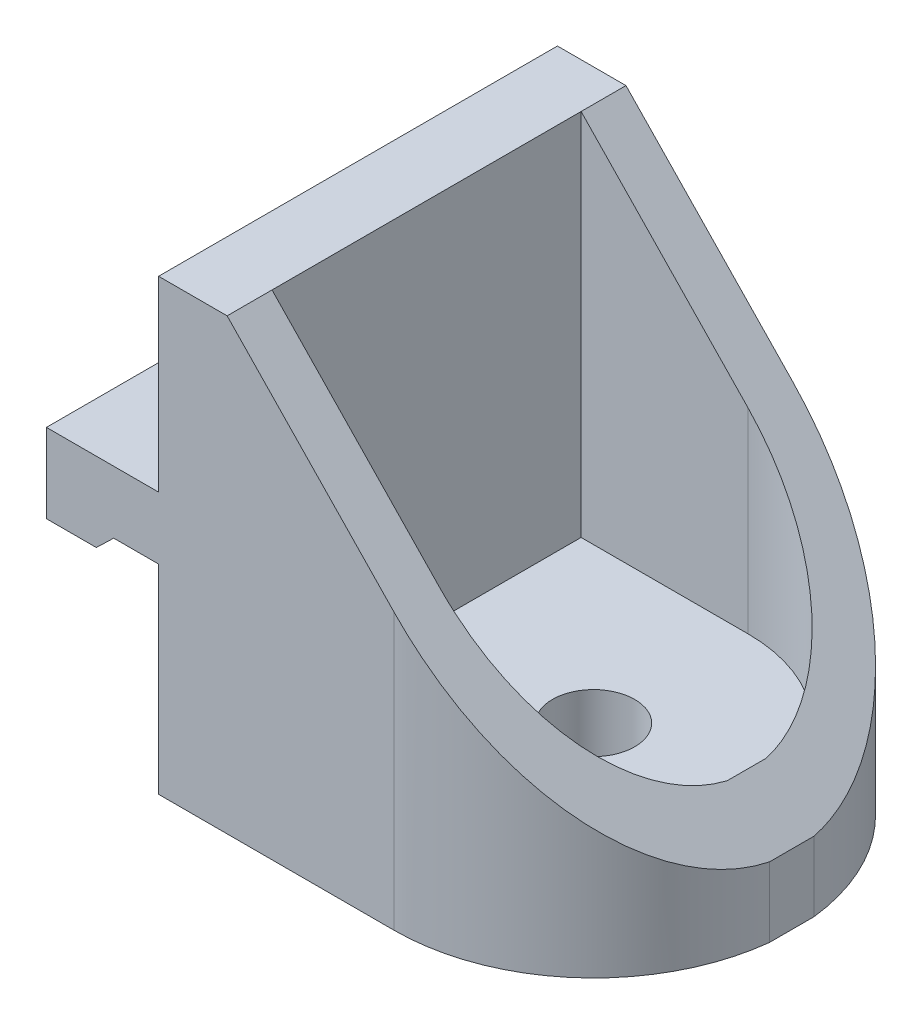
ISO-10303-21;
HEADER;
FILE_DESCRIPTION(('STEP AP214'),'2;1');
FILE_NAME('part.step','',(''),(''),'','','');
FILE_SCHEMA(('AUTOMOTIVE_DESIGN { 1 0 10303 214 1 1 1 1 }'));
ENDSEC;
DATA;
#1=APPLICATION_CONTEXT('core data for automotive mechanical design processes');
#2=APPLICATION_PROTOCOL_DEFINITION('international standard','automotive_design',2000,#1);
#3=PRODUCT_CONTEXT('',#1,'mechanical');
#4=PRODUCT('Part','Part','',(#3));
#5=PRODUCT_RELATED_PRODUCT_CATEGORY('part','',(#4));
#6=PRODUCT_DEFINITION_FORMATION('','',#4);
#7=PRODUCT_DEFINITION_CONTEXT('part definition',#1,'design');
#8=PRODUCT_DEFINITION('design','',#6,#7);
#9=PRODUCT_DEFINITION_SHAPE('','',#8);
#10=(LENGTH_UNIT() NAMED_UNIT(*) SI_UNIT(.MILLI.,.METRE.));
#11=(NAMED_UNIT(*) PLANE_ANGLE_UNIT() SI_UNIT($,.RADIAN.));
#12=(NAMED_UNIT(*) SI_UNIT($,.STERADIAN.) SOLID_ANGLE_UNIT());
#13=UNCERTAINTY_MEASURE_WITH_UNIT(LENGTH_MEASURE(1.E-05),#10,'distance_accuracy_value','');
#14=(GEOMETRIC_REPRESENTATION_CONTEXT(3) GLOBAL_UNCERTAINTY_ASSIGNED_CONTEXT((#13)) GLOBAL_UNIT_ASSIGNED_CONTEXT((#10,
#11,#12)) REPRESENTATION_CONTEXT('',''));
#15=CARTESIAN_POINT('',(0.,0.,0.));
#16=DIRECTION('',(0.,0.,1.));
#17=DIRECTION('',(1.,0.,0.));
#18=AXIS2_PLACEMENT_3D('',#15,#16,#17);
#19=CARTESIAN_POINT('',(-13.4,36.,16.));
#20=DIRECTION('',(-0.720013338320777,-0.693960224105223,0.));
#21=DIRECTION('',(0.693960224105223,-0.720013338320777,0.));
#22=AXIS2_PLACEMENT_3D('',#19,#20,#21);
#23=PLANE('',#22);
#24=DIRECTION('',(-0.693960224105223,0.720013338320777,0.));
#25=VECTOR('',#24,1.);
#26=CARTESIAN_POINT('',(-13.4,36.,-12.4));
#27=LINE('',#26,#25);
#28=CARTESIAN_POINT('',(0.,22.096928327645,-12.4));
#29=VERTEX_POINT('',#28);
#30=CARTESIAN_POINT('',(-13.4,36.,-12.4));
#31=VERTEX_POINT('',#30);
#32=EDGE_CURVE('E11',#29,#31,#27,.T.);
#33=ORIENTED_EDGE('',*,*,#32,.F.);
#34=CARTESIAN_POINT('',(0.,22.096928327645,0.));
#35=DIRECTION('',(-0.720013338320777,-0.693960224105223,0.));
#36=DIRECTION('',(0.693960224105223,-0.720013338320777,0.));
#37=AXIS2_PLACEMENT_3D('',#34,#35,#36);
#38=ELLIPSE('',#37,17.8684592708297,12.4);
#39=CARTESIAN_POINT('',(12.3,9.33515358361774,-1.57162336455017));
#40=VERTEX_POINT('',#39);
#41=EDGE_CURVE('E45',#40,#29,#38,.F.);
#42=ORIENTED_EDGE('',*,*,#41,.F.);
#43=DIRECTION('',(0.,0.,-1.));
#44=VECTOR('',#43,1.);
#45=CARTESIAN_POINT('',(12.3,9.33515358361774,16.));
#46=LINE('',#45,#44);
#47=CARTESIAN_POINT('',(12.3,9.33515358361774,1.57162336455017));
#48=VERTEX_POINT('',#47);
#49=EDGE_CURVE('E209',#48,#40,#46,.T.);
#50=ORIENTED_EDGE('',*,*,#49,.F.);
#51=CARTESIAN_POINT('',(0.,22.096928327645,0.));
#52=DIRECTION('',(-0.720013338320777,-0.693960224105223,0.));
#53=DIRECTION('',(0.693960224105223,-0.720013338320777,0.));
#54=AXIS2_PLACEMENT_3D('',#51,#52,#53);
#55=ELLIPSE('',#54,17.8684592708297,12.4);
#56=CARTESIAN_POINT('',(0.,22.096928327645,12.4));
#57=VERTEX_POINT('',#56);
#58=EDGE_CURVE('E192',#57,#48,#55,.F.);
#59=ORIENTED_EDGE('',*,*,#58,.F.);
#60=DIRECTION('',(0.693960224105223,-0.720013338320777,0.));
#61=VECTOR('',#60,1.);
#62=CARTESIAN_POINT('',(-13.4,36.,12.4));
#63=LINE('',#62,#61);
#64=CARTESIAN_POINT('',(-13.4,36.,12.4));
#65=VERTEX_POINT('',#64);
#66=EDGE_CURVE('E180',#65,#57,#63,.T.);
#67=ORIENTED_EDGE('',*,*,#66,.F.);
#68=DIRECTION('',(0.,0.,-1.));
#69=VECTOR('',#68,1.);
#70=CARTESIAN_POINT('',(-13.4,36.,16.));
#71=LINE('',#70,#69);
#72=CARTESIAN_POINT('',(-13.4,36.,16.));
#73=VERTEX_POINT('',#72);
#74=EDGE_CURVE('E189',#73,#65,#71,.T.);
#75=ORIENTED_EDGE('',*,*,#74,.F.);
#76=DIRECTION('',(-0.693960224105223,0.720013338320777,0.));
#77=VECTOR('',#76,1.);
#78=CARTESIAN_POINT('',(-13.4,36.,16.));
#79=LINE('',#78,#77);
#80=CARTESIAN_POINT('',(0.,22.096928327645,16.));
#81=VERTEX_POINT('',#80);
#82=EDGE_CURVE('E266',#81,#73,#79,.T.);
#83=ORIENTED_EDGE('',*,*,#82,.F.);
#84=CARTESIAN_POINT('',(0.,22.096928327645,0.));
#85=DIRECTION('',(-0.720013338320777,-0.693960224105223,0.));
#86=DIRECTION('',(0.693960224105223,-0.720013338320777,0.));
#87=AXIS2_PLACEMENT_3D('',#84,#85,#86);
#88=ELLIPSE('',#87,23.0560764784899,16.);
#89=CARTESIAN_POINT('',(15.9,5.6,1.78605710994921));
#90=VERTEX_POINT('',#89);
#91=EDGE_CURVE('E59',#81,#90,#88,.F.);
#92=ORIENTED_EDGE('',*,*,#91,.T.);
#93=DIRECTION('',(0.,0.,-1.));
#94=VECTOR('',#93,1.);
#95=CARTESIAN_POINT('',(15.9,5.6,16.));
#96=LINE('',#95,#94);
#97=CARTESIAN_POINT('',(15.9,5.6,-1.7860571099492));
#98=VERTEX_POINT('',#97);
#99=EDGE_CURVE('E198',#90,#98,#96,.T.);
#100=ORIENTED_EDGE('',*,*,#99,.T.);
#101=CARTESIAN_POINT('',(0.,22.096928327645,-16.));
#102=VERTEX_POINT('',#101);
#103=EDGE_CURVE('E312',#98,#102,#88,.F.);
#104=ORIENTED_EDGE('',*,*,#103,.T.);
#105=DIRECTION('',(-0.693960224105223,0.720013338320777,0.));
#106=VECTOR('',#105,1.);
#107=CARTESIAN_POINT('',(-13.4,36.,-16.));
#108=LINE('',#107,#106);
#109=CARTESIAN_POINT('',(-13.4,36.,-16.));
#110=VERTEX_POINT('',#109);
#111=EDGE_CURVE('E229',#102,#110,#108,.T.);
#112=ORIENTED_EDGE('',*,*,#111,.T.);
#113=EDGE_CURVE('E199',#31,#110,#71,.T.);
#114=ORIENTED_EDGE('',*,*,#113,.F.);
#115=EDGE_LOOP('',(#33,#42,#50,#59,#67,#75,#83,#92,#100,#104,#112,#114));
#116=FACE_BOUND('',#115,.T.);
#117=ADVANCED_FACE('F36',(#116),#23,.F.);
#118=CARTESIAN_POINT('',(15.9,0.,16.));
#119=DIRECTION('',(0.,1.,0.));
#120=DIRECTION('',(-1.,0.,0.));
#121=AXIS2_PLACEMENT_3D('',#118,#119,#120);
#122=PLANE('',#121);
#123=CARTESIAN_POINT('',(0.,0.,0.));
#124=DIRECTION('',(0.,1.,0.));
#125=DIRECTION('',(0.,0.,1.));
#126=AXIS2_PLACEMENT_3D('',#123,#124,#125);
#127=CIRCLE('',#126,3.29864911449007);
#128=CARTESIAN_POINT('',(0.,0.,3.29864911449007));
#129=VERTEX_POINT('',#128);
#130=EDGE_CURVE('E591',#129,#129,#127,.T.);
#131=ORIENTED_EDGE('',*,*,#130,.T.);
#132=EDGE_LOOP('',(#131));
#133=FACE_BOUND('',#132,.T.);
#134=DIRECTION('',(1.,0.,0.));
#135=VECTOR('',#134,1.);
#136=CARTESIAN_POINT('',(15.9,0.,-16.));
#137=LINE('',#136,#135);
#138=CARTESIAN_POINT('',(-18.9,0.,-16.));
#139=VERTEX_POINT('',#138);
#140=CARTESIAN_POINT('',(0.,0.,-16.));
#141=VERTEX_POINT('',#140);
#142=EDGE_CURVE('E263',#139,#141,#137,.T.);
#143=ORIENTED_EDGE('',*,*,#142,.T.);
#144=CARTESIAN_POINT('',(0.,0.,0.));
#145=DIRECTION('',(0.,1.,0.));
#146=DIRECTION('',(-1.,0.,0.));
#147=AXIS2_PLACEMENT_3D('',#144,#145,#146);
#148=CIRCLE('',#147,16.);
#149=CARTESIAN_POINT('',(15.9,0.,-1.78605710994917));
#150=VERTEX_POINT('',#149);
#151=EDGE_CURVE('E330',#150,#141,#148,.T.);
#152=ORIENTED_EDGE('',*,*,#151,.F.);
#153=DIRECTION('',(0.,0.,-1.));
#154=VECTOR('',#153,1.);
#155=CARTESIAN_POINT('',(15.9,0.,16.));
#156=LINE('',#155,#154);
#157=CARTESIAN_POINT('',(15.9,0.,1.78605710994917));
#158=VERTEX_POINT('',#157);
#159=EDGE_CURVE('E267',#158,#150,#156,.T.);
#160=ORIENTED_EDGE('',*,*,#159,.F.);
#161=CARTESIAN_POINT('',(0.,0.,16.));
#162=VERTEX_POINT('',#161);
#163=EDGE_CURVE('E329',#162,#158,#148,.T.);
#164=ORIENTED_EDGE('',*,*,#163,.F.);
#165=DIRECTION('',(1.,0.,0.));
#166=VECTOR('',#165,1.);
#167=CARTESIAN_POINT('',(15.9,0.,16.));
#168=LINE('',#167,#166);
#169=CARTESIAN_POINT('',(-18.9,0.,16.));
#170=VERTEX_POINT('',#169);
#171=EDGE_CURVE('E271',#170,#162,#168,.T.);
#172=ORIENTED_EDGE('',*,*,#171,.F.);
#173=DIRECTION('',(0.,0.,-1.));
#174=VECTOR('',#173,1.);
#175=CARTESIAN_POINT('',(-18.9,0.,16.));
#176=LINE('',#175,#174);
#177=EDGE_CURVE('E270',#170,#139,#176,.T.);
#178=ORIENTED_EDGE('',*,*,#177,.T.);
#179=EDGE_LOOP('',(#143,#152,#160,#164,#172,#178));
#180=FACE_BOUND('',#179,.T.);
#181=ADVANCED_FACE('F327',(#133,#180),#122,.F.);
#182=CARTESIAN_POINT('',(15.9,5.6,16.));
#183=DIRECTION('',(-1.,0.,0.));
#184=DIRECTION('',(0.,-1.,0.));
#185=AXIS2_PLACEMENT_3D('',#182,#183,#184);
#186=PLANE('',#185);
#187=ORIENTED_EDGE('',*,*,#159,.T.);
#188=DIRECTION('',(0.,-1.,0.));
#189=VECTOR('',#188,1.);
#190=CARTESIAN_POINT('',(15.9,36.,-1.78605710994932));
#191=LINE('',#190,#189);
#192=EDGE_CURVE('E310',#150,#98,#191,.F.);
#193=ORIENTED_EDGE('',*,*,#192,.T.);
#194=ORIENTED_EDGE('',*,*,#99,.F.);
#195=DIRECTION('',(0.,-1.,0.));
#196=VECTOR('',#195,1.);
#197=CARTESIAN_POINT('',(15.9,36.,1.78605710994932));
#198=LINE('',#197,#196);
#199=EDGE_CURVE('E316',#90,#158,#198,.T.);
#200=ORIENTED_EDGE('',*,*,#199,.T.);
#201=EDGE_LOOP('',(#187,#193,#194,#200));
#202=FACE_BOUND('',#201,.T.);
#203=ADVANCED_FACE('F38',(#202),#186,.F.);
#204=CARTESIAN_POINT('',(-18.9,36.,16.));
#205=DIRECTION('',(0.,-1.,0.));
#206=DIRECTION('',(0.,0.,-1.));
#207=AXIS2_PLACEMENT_3D('',#204,#205,#206);
#208=PLANE('',#207);
#209=DIRECTION('',(-1.,0.,0.));
#210=VECTOR('',#209,1.);
#211=CARTESIAN_POINT('',(-18.9,36.,-16.));
#212=LINE('',#211,#210);
#213=CARTESIAN_POINT('',(-18.9,36.,-16.));
#214=VERTEX_POINT('',#213);
#215=EDGE_CURVE('E231',#110,#214,#212,.T.);
#216=ORIENTED_EDGE('',*,*,#215,.T.);
#217=DIRECTION('',(0.,0.,-1.));
#218=VECTOR('',#217,1.);
#219=CARTESIAN_POINT('',(-18.9,36.,16.));
#220=LINE('',#219,#218);
#221=CARTESIAN_POINT('',(-18.9,36.,16.));
#222=VERTEX_POINT('',#221);
#223=EDGE_CURVE('E203',#222,#214,#220,.T.);
#224=ORIENTED_EDGE('',*,*,#223,.F.);
#225=DIRECTION('',(-1.,0.,0.));
#226=VECTOR('',#225,1.);
#227=CARTESIAN_POINT('',(-18.9,36.,16.));
#228=LINE('',#227,#226);
#229=EDGE_CURVE('E197',#73,#222,#228,.T.);
#230=ORIENTED_EDGE('',*,*,#229,.F.);
#231=ORIENTED_EDGE('',*,*,#74,.T.);
#232=DIRECTION('',(0.,0.,1.));
#233=VECTOR('',#232,1.);
#234=CARTESIAN_POINT('',(-13.4,36.,12.4));
#235=LINE('',#234,#233);
#236=EDGE_CURVE('E167',#31,#65,#235,.T.);
#237=ORIENTED_EDGE('',*,*,#236,.F.);
#238=ORIENTED_EDGE('',*,*,#113,.T.);
#239=EDGE_LOOP('',(#216,#224,#230,#231,#237,#238));
#240=FACE_BOUND('',#239,.T.);
#241=ADVANCED_FACE('F195',(#240),#208,.F.);
#242=CARTESIAN_POINT('',(-18.9,21.,16.));
#243=DIRECTION('',(1.,0.,0.));
#244=DIRECTION('',(0.,0.,-1.));
#245=AXIS2_PLACEMENT_3D('',#242,#243,#244);
#246=PLANE('',#245);
#247=DIRECTION('',(0.,-1.,0.));
#248=VECTOR('',#247,1.);
#249=CARTESIAN_POINT('',(-18.9,21.,-16.));
#250=LINE('',#249,#248);
#251=CARTESIAN_POINT('',(-18.9,21.,-16.));
#252=VERTEX_POINT('',#251);
#253=EDGE_CURVE('E236',#214,#252,#250,.T.);
#254=ORIENTED_EDGE('',*,*,#253,.T.);
#255=DIRECTION('',(0.,0.,-1.));
#256=VECTOR('',#255,1.);
#257=CARTESIAN_POINT('',(-18.9,21.,16.));
#258=LINE('',#257,#256);
#259=CARTESIAN_POINT('',(-18.9,21.,16.));
#260=VERTEX_POINT('',#259);
#261=EDGE_CURVE('E243',#260,#252,#258,.T.);
#262=ORIENTED_EDGE('',*,*,#261,.F.);
#263=DIRECTION('',(0.,-1.,0.));
#264=VECTOR('',#263,1.);
#265=CARTESIAN_POINT('',(-18.9,21.,16.));
#266=LINE('',#265,#264);
#267=EDGE_CURVE('E242',#222,#260,#266,.T.);
#268=ORIENTED_EDGE('',*,*,#267,.F.);
#269=ORIENTED_EDGE('',*,*,#223,.T.);
#270=EDGE_LOOP('',(#254,#262,#268,#269));
#271=FACE_BOUND('',#270,.T.);
#272=ADVANCED_FACE('F239',(#271),#246,.F.);
#273=CARTESIAN_POINT('',(-18.9,21.,16.));
#274=DIRECTION('',(0.,-1.,0.));
#275=DIRECTION('',(0.,0.,-1.));
#276=AXIS2_PLACEMENT_3D('',#273,#274,#275);
#277=PLANE('',#276);
#278=DIRECTION('',(-1.,0.,0.));
#279=VECTOR('',#278,1.);
#280=CARTESIAN_POINT('',(-18.9,21.,-16.));
#281=LINE('',#280,#279);
#282=CARTESIAN_POINT('',(-27.9,21.,-16.));
#283=VERTEX_POINT('',#282);
#284=EDGE_CURVE('E248',#252,#283,#281,.T.);
#285=ORIENTED_EDGE('',*,*,#284,.T.);
#286=DIRECTION('',(0.,0.,-1.));
#287=VECTOR('',#286,1.);
#288=CARTESIAN_POINT('',(-27.9,21.,16.));
#289=LINE('',#288,#287);
#290=CARTESIAN_POINT('',(-27.9,21.,16.));
#291=VERTEX_POINT('',#290);
#292=EDGE_CURVE('E286',#291,#283,#289,.T.);
#293=ORIENTED_EDGE('',*,*,#292,.F.);
#294=DIRECTION('',(-1.,0.,0.));
#295=VECTOR('',#294,1.);
#296=CARTESIAN_POINT('',(-18.9,21.,16.));
#297=LINE('',#296,#295);
#298=EDGE_CURVE('E292',#260,#291,#297,.T.);
#299=ORIENTED_EDGE('',*,*,#298,.F.);
#300=ORIENTED_EDGE('',*,*,#261,.T.);
#301=EDGE_LOOP('',(#285,#293,#299,#300));
#302=FACE_BOUND('',#301,.T.);
#303=ADVANCED_FACE('F290',(#302),#277,.F.);
#304=CARTESIAN_POINT('',(-27.9,21.,16.));
#305=DIRECTION('',(1.,0.,0.));
#306=DIRECTION('',(0.,0.,-1.));
#307=AXIS2_PLACEMENT_3D('',#304,#305,#306);
#308=PLANE('',#307);
#309=DIRECTION('',(0.,-1.,0.));
#310=VECTOR('',#309,1.);
#311=CARTESIAN_POINT('',(-27.9,21.,-16.));
#312=LINE('',#311,#310);
#313=CARTESIAN_POINT('',(-27.9,14.6506578947368,-16.));
#314=VERTEX_POINT('',#313);
#315=EDGE_CURVE('E250',#283,#314,#312,.T.);
#316=ORIENTED_EDGE('',*,*,#315,.T.);
#317=DIRECTION('',(0.,0.,-1.));
#318=VECTOR('',#317,1.);
#319=CARTESIAN_POINT('',(-27.9,14.6506578947368,16.));
#320=LINE('',#319,#318);
#321=CARTESIAN_POINT('',(-27.9,14.6506578947368,16.));
#322=VERTEX_POINT('',#321);
#323=EDGE_CURVE('E283',#322,#314,#320,.T.);
#324=ORIENTED_EDGE('',*,*,#323,.F.);
#325=DIRECTION('',(0.,-1.,0.));
#326=VECTOR('',#325,1.);
#327=CARTESIAN_POINT('',(-27.9,21.,16.));
#328=LINE('',#327,#326);
#329=EDGE_CURVE('E295',#291,#322,#328,.T.);
#330=ORIENTED_EDGE('',*,*,#329,.F.);
#331=ORIENTED_EDGE('',*,*,#292,.T.);
#332=EDGE_LOOP('',(#316,#324,#330,#331));
#333=FACE_BOUND('',#332,.T.);
#334=ADVANCED_FACE('F364',(#333),#308,.F.);
#335=CARTESIAN_POINT('',(-27.9,14.6506578947368,16.));
#336=DIRECTION('',(0.,1.,0.));
#337=DIRECTION('',(0.,0.,1.));
#338=AXIS2_PLACEMENT_3D('',#335,#336,#337);
#339=PLANE('',#338);
#340=DIRECTION('',(1.,0.,0.));
#341=VECTOR('',#340,1.);
#342=CARTESIAN_POINT('',(-27.9,14.6506578947368,-16.));
#343=LINE('',#342,#341);
#344=CARTESIAN_POINT('',(-23.9,14.6506578947368,-16.));
#345=VERTEX_POINT('',#344);
#346=EDGE_CURVE('E255',#314,#345,#343,.T.);
#347=ORIENTED_EDGE('',*,*,#346,.T.);
#348=DIRECTION('',(0.,0.,-1.));
#349=VECTOR('',#348,1.);
#350=CARTESIAN_POINT('',(-23.9,14.6506578947368,16.));
#351=LINE('',#350,#349);
#352=CARTESIAN_POINT('',(-23.9,14.6506578947368,16.));
#353=VERTEX_POINT('',#352);
#354=EDGE_CURVE('E280',#353,#345,#351,.T.);
#355=ORIENTED_EDGE('',*,*,#354,.F.);
#356=DIRECTION('',(1.,0.,0.));
#357=VECTOR('',#356,1.);
#358=CARTESIAN_POINT('',(-27.9,14.6506578947368,16.));
#359=LINE('',#358,#357);
#360=EDGE_CURVE('E297',#322,#353,#359,.T.);
#361=ORIENTED_EDGE('',*,*,#360,.F.);
#362=ORIENTED_EDGE('',*,*,#323,.T.);
#363=EDGE_LOOP('',(#347,#355,#361,#362));
#364=FACE_BOUND('',#363,.T.);
#365=ADVANCED_FACE('F367',(#364),#339,.F.);
#366=CARTESIAN_POINT('',(-23.9,14.6506578947368,16.));
#367=DIRECTION('',(-0.693960224105223,0.720013338320776,0.));
#368=DIRECTION('',(-0.720013338320776,-0.693960224105223,0.));
#369=AXIS2_PLACEMENT_3D('',#366,#367,#368);
#370=PLANE('',#369);
#371=DIRECTION('',(0.720013338320776,0.693960224105223,0.));
#372=VECTOR('',#371,1.);
#373=CARTESIAN_POINT('',(-23.9,14.6506578947368,-16.));
#374=LINE('',#373,#372);
#375=CARTESIAN_POINT('',(-22.5,16.,-16.));
#376=VERTEX_POINT('',#375);
#377=EDGE_CURVE('E257',#345,#376,#374,.T.);
#378=ORIENTED_EDGE('',*,*,#377,.T.);
#379=DIRECTION('',(0.,0.,-1.));
#380=VECTOR('',#379,1.);
#381=CARTESIAN_POINT('',(-22.5,16.,16.));
#382=LINE('',#381,#380);
#383=CARTESIAN_POINT('',(-22.5,16.,16.));
#384=VERTEX_POINT('',#383);
#385=EDGE_CURVE('E277',#384,#376,#382,.T.);
#386=ORIENTED_EDGE('',*,*,#385,.F.);
#387=DIRECTION('',(0.720013338320776,0.693960224105223,0.));
#388=VECTOR('',#387,1.);
#389=CARTESIAN_POINT('',(-23.9,14.6506578947368,16.));
#390=LINE('',#389,#388);
#391=EDGE_CURVE('E303',#353,#384,#390,.T.);
#392=ORIENTED_EDGE('',*,*,#391,.F.);
#393=ORIENTED_EDGE('',*,*,#354,.T.);
#394=EDGE_LOOP('',(#378,#386,#392,#393));
#395=FACE_BOUND('',#394,.T.);
#396=ADVANCED_FACE('F371',(#395),#370,.F.);
#397=CARTESIAN_POINT('',(-22.5,16.,16.));
#398=DIRECTION('',(0.,1.,0.));
#399=DIRECTION('',(0.,0.,1.));
#400=AXIS2_PLACEMENT_3D('',#397,#398,#399);
#401=PLANE('',#400);
#402=DIRECTION('',(1.,0.,0.));
#403=VECTOR('',#402,1.);
#404=CARTESIAN_POINT('',(-22.5,16.,-16.));
#405=LINE('',#404,#403);
#406=CARTESIAN_POINT('',(-18.9,16.,-16.));
#407=VERTEX_POINT('',#406);
#408=EDGE_CURVE('E259',#376,#407,#405,.T.);
#409=ORIENTED_EDGE('',*,*,#408,.T.);
#410=DIRECTION('',(0.,0.,-1.));
#411=VECTOR('',#410,1.);
#412=CARTESIAN_POINT('',(-18.9,16.,16.));
#413=LINE('',#412,#411);
#414=CARTESIAN_POINT('',(-18.9,16.,16.));
#415=VERTEX_POINT('',#414);
#416=EDGE_CURVE('E274',#415,#407,#413,.T.);
#417=ORIENTED_EDGE('',*,*,#416,.F.);
#418=DIRECTION('',(1.,0.,0.));
#419=VECTOR('',#418,1.);
#420=CARTESIAN_POINT('',(-22.5,16.,16.));
#421=LINE('',#420,#419);
#422=EDGE_CURVE('E305',#384,#415,#421,.T.);
#423=ORIENTED_EDGE('',*,*,#422,.F.);
#424=ORIENTED_EDGE('',*,*,#385,.T.);
#425=EDGE_LOOP('',(#409,#417,#423,#424));
#426=FACE_BOUND('',#425,.T.);
#427=ADVANCED_FACE('F375',(#426),#401,.F.);
#428=CARTESIAN_POINT('',(-18.9,0.,16.));
#429=DIRECTION('',(1.,0.,0.));
#430=DIRECTION('',(0.,0.,-1.));
#431=AXIS2_PLACEMENT_3D('',#428,#429,#430);
#432=PLANE('',#431);
#433=DIRECTION('',(0.,-1.,0.));
#434=VECTOR('',#433,1.);
#435=CARTESIAN_POINT('',(-18.9,0.,-16.));
#436=LINE('',#435,#434);
#437=EDGE_CURVE('E261',#407,#139,#436,.T.);
#438=ORIENTED_EDGE('',*,*,#437,.T.);
#439=ORIENTED_EDGE('',*,*,#177,.F.);
#440=DIRECTION('',(0.,-1.,0.));
#441=VECTOR('',#440,1.);
#442=CARTESIAN_POINT('',(-18.9,0.,16.));
#443=LINE('',#442,#441);
#444=EDGE_CURVE('E307',#415,#170,#443,.T.);
#445=ORIENTED_EDGE('',*,*,#444,.F.);
#446=ORIENTED_EDGE('',*,*,#416,.T.);
#447=EDGE_LOOP('',(#438,#439,#445,#446));
#448=FACE_BOUND('',#447,.T.);
#449=ADVANCED_FACE('F379',(#448),#432,.F.);
#450=CARTESIAN_POINT('',(0.,0.,16.));
#451=DIRECTION('',(0.,0.,-1.));
#452=DIRECTION('',(-1.,0.,0.));
#453=AXIS2_PLACEMENT_3D('',#450,#451,#452);
#454=PLANE('',#453);
#455=ORIENTED_EDGE('',*,*,#171,.T.);
#456=DIRECTION('',(0.,-1.,0.));
#457=VECTOR('',#456,1.);
#458=CARTESIAN_POINT('',(0.,36.,16.));
#459=LINE('',#458,#457);
#460=EDGE_CURVE('E321',#81,#162,#459,.T.);
#461=ORIENTED_EDGE('',*,*,#460,.F.);
#462=ORIENTED_EDGE('',*,*,#82,.T.);
#463=ORIENTED_EDGE('',*,*,#229,.T.);
#464=ORIENTED_EDGE('',*,*,#267,.T.);
#465=ORIENTED_EDGE('',*,*,#298,.T.);
#466=ORIENTED_EDGE('',*,*,#329,.T.);
#467=ORIENTED_EDGE('',*,*,#360,.T.);
#468=ORIENTED_EDGE('',*,*,#391,.T.);
#469=ORIENTED_EDGE('',*,*,#422,.T.);
#470=ORIENTED_EDGE('',*,*,#444,.T.);
#471=EDGE_LOOP('',(#455,#461,#462,#463,#464,#465,#466,#467,#468,#469,#470));
#472=FACE_BOUND('',#471,.T.);
#473=ADVANCED_FACE('F320',(#472),#454,.F.);
#474=CARTESIAN_POINT('',(0.,0.,-16.));
#475=DIRECTION('',(0.,0.,-1.));
#476=DIRECTION('',(-1.,0.,0.));
#477=AXIS2_PLACEMENT_3D('',#474,#475,#476);
#478=PLANE('',#477);
#479=DIRECTION('',(0.,1.,0.));
#480=VECTOR('',#479,1.);
#481=CARTESIAN_POINT('',(0.,0.,-16.));
#482=LINE('',#481,#480);
#483=EDGE_CURVE('E193',#141,#102,#482,.T.);
#484=ORIENTED_EDGE('',*,*,#483,.F.);
#485=ORIENTED_EDGE('',*,*,#142,.F.);
#486=ORIENTED_EDGE('',*,*,#437,.F.);
#487=ORIENTED_EDGE('',*,*,#408,.F.);
#488=ORIENTED_EDGE('',*,*,#377,.F.);
#489=ORIENTED_EDGE('',*,*,#346,.F.);
#490=ORIENTED_EDGE('',*,*,#315,.F.);
#491=ORIENTED_EDGE('',*,*,#284,.F.);
#492=ORIENTED_EDGE('',*,*,#253,.F.);
#493=ORIENTED_EDGE('',*,*,#215,.F.);
#494=ORIENTED_EDGE('',*,*,#111,.F.);
#495=EDGE_LOOP('',(#484,#485,#486,#487,#488,#489,#490,#491,#492,#493,#494));
#496=FACE_BOUND('',#495,.T.);
#497=ADVANCED_FACE('F246',(#496),#478,.T.);
#498=CARTESIAN_POINT('',(0.,36.,0.));
#499=DIRECTION('',(0.,-1.,0.));
#500=DIRECTION('',(1.,0.,0.));
#501=AXIS2_PLACEMENT_3D('',#498,#499,#500);
#502=CYLINDRICAL_SURFACE('',#501,16.);
#503=ORIENTED_EDGE('',*,*,#151,.T.);
#504=ORIENTED_EDGE('',*,*,#483,.T.);
#505=ORIENTED_EDGE('',*,*,#103,.F.);
#506=ORIENTED_EDGE('',*,*,#192,.F.);
#507=EDGE_LOOP('',(#503,#504,#505,#506));
#508=FACE_BOUND('',#507,.T.);
#509=ADVANCED_FACE('F341',(#508),#502,.T.);
#510=ORIENTED_EDGE('',*,*,#91,.F.);
#511=ORIENTED_EDGE('',*,*,#460,.T.);
#512=ORIENTED_EDGE('',*,*,#163,.T.);
#513=ORIENTED_EDGE('',*,*,#199,.F.);
#514=EDGE_LOOP('',(#510,#511,#512,#513));
#515=FACE_BOUND('',#514,.T.);
#516=ADVANCED_FACE('F338',(#515),#502,.T.);
#517=CARTESIAN_POINT('',(0.,36.,0.));
#518=DIRECTION('',(0.,-1.,0.));
#519=DIRECTION('',(0.,0.,-1.));
#520=AXIS2_PLACEMENT_3D('',#517,#518,#519);
#521=CYLINDRICAL_SURFACE('',#520,12.4);
#522=ORIENTED_EDGE('',*,*,#58,.T.);
#523=DIRECTION('',(0.,-1.,0.));
#524=VECTOR('',#523,1.);
#525=CARTESIAN_POINT('',(12.3,36.,1.57162336455017));
#526=LINE('',#525,#524);
#527=CARTESIAN_POINT('',(12.3,6.4,1.57162336455017));
#528=VERTEX_POINT('',#527);
#529=EDGE_CURVE('E333',#48,#528,#526,.T.);
#530=ORIENTED_EDGE('',*,*,#529,.T.);
#531=CARTESIAN_POINT('',(0.,6.4,0.));
#532=DIRECTION('',(0.,1.,0.));
#533=DIRECTION('',(0.,0.,1.));
#534=AXIS2_PLACEMENT_3D('',#531,#532,#533);
#535=CIRCLE('',#534,12.4);
#536=CARTESIAN_POINT('',(0.,6.4,12.4));
#537=VERTEX_POINT('',#536);
#538=EDGE_CURVE('E593',#537,#528,#535,.T.);
#539=ORIENTED_EDGE('',*,*,#538,.F.);
#540=DIRECTION('',(0.,-1.,0.));
#541=VECTOR('',#540,1.);
#542=CARTESIAN_POINT('',(0.,36.,12.4));
#543=LINE('',#542,#541);
#544=EDGE_CURVE('E174',#57,#537,#543,.T.);
#545=ORIENTED_EDGE('',*,*,#544,.F.);
#546=EDGE_LOOP('',(#522,#530,#539,#545));
#547=FACE_BOUND('',#546,.T.);
#548=ADVANCED_FACE('F340',(#547),#521,.F.);
#549=CARTESIAN_POINT('',(12.3,36.,1.57162336455017));
#550=DIRECTION('',(-1.,0.,0.));
#551=DIRECTION('',(0.,0.,1.));
#552=AXIS2_PLACEMENT_3D('',#549,#550,#551);
#553=PLANE('',#552);
#554=ORIENTED_EDGE('',*,*,#49,.T.);
#555=DIRECTION('',(0.,-1.,0.));
#556=VECTOR('',#555,1.);
#557=CARTESIAN_POINT('',(12.3,36.,-1.57162336455017));
#558=LINE('',#557,#556);
#559=CARTESIAN_POINT('',(12.3,6.4,-1.57162336455017));
#560=VERTEX_POINT('',#559);
#561=EDGE_CURVE('E219',#40,#560,#558,.T.);
#562=ORIENTED_EDGE('',*,*,#561,.T.);
#563=DIRECTION('',(0.,0.,-1.));
#564=VECTOR('',#563,1.);
#565=CARTESIAN_POINT('',(12.3,6.4,1.57162336455017));
#566=LINE('',#565,#564);
#567=EDGE_CURVE('E597',#528,#560,#566,.T.);
#568=ORIENTED_EDGE('',*,*,#567,.F.);
#569=ORIENTED_EDGE('',*,*,#529,.F.);
#570=EDGE_LOOP('',(#554,#562,#568,#569));
#571=FACE_BOUND('',#570,.T.);
#572=ADVANCED_FACE('F347',(#571),#553,.T.);
#573=CARTESIAN_POINT('',(0.,36.,0.));
#574=DIRECTION('',(0.,-1.,0.));
#575=DIRECTION('',(0.,0.,-1.));
#576=AXIS2_PLACEMENT_3D('',#573,#574,#575);
#577=CYLINDRICAL_SURFACE('',#576,12.4);
#578=ORIENTED_EDGE('',*,*,#41,.T.);
#579=DIRECTION('',(0.,-1.,0.));
#580=VECTOR('',#579,1.);
#581=CARTESIAN_POINT('',(0.,36.,-12.4));
#582=LINE('',#581,#580);
#583=CARTESIAN_POINT('',(0.,6.4,-12.4));
#584=VERTEX_POINT('',#583);
#585=EDGE_CURVE('E217',#29,#584,#582,.T.);
#586=ORIENTED_EDGE('',*,*,#585,.T.);
#587=CARTESIAN_POINT('',(0.,6.4,0.));
#588=DIRECTION('',(0.,1.,0.));
#589=DIRECTION('',(0.,0.,1.));
#590=AXIS2_PLACEMENT_3D('',#587,#588,#589);
#591=CIRCLE('',#590,12.4);
#592=EDGE_CURVE('E600',#560,#584,#591,.T.);
#593=ORIENTED_EDGE('',*,*,#592,.F.);
#594=ORIENTED_EDGE('',*,*,#561,.F.);
#595=EDGE_LOOP('',(#578,#586,#593,#594));
#596=FACE_BOUND('',#595,.T.);
#597=ADVANCED_FACE('F215',(#596),#577,.F.);
#598=CARTESIAN_POINT('',(0.,36.,-12.4));
#599=DIRECTION('',(0.,0.,1.));
#600=DIRECTION('',(1.,0.,0.));
#601=AXIS2_PLACEMENT_3D('',#598,#599,#600);
#602=PLANE('',#601);
#603=ORIENTED_EDGE('',*,*,#32,.T.);
#604=DIRECTION('',(0.,-1.,0.));
#605=VECTOR('',#604,1.);
#606=CARTESIAN_POINT('',(-13.4,36.,-12.4));
#607=LINE('',#606,#605);
#608=CARTESIAN_POINT('',(-13.4,6.4,-12.4));
#609=VERTEX_POINT('',#608);
#610=EDGE_CURVE('E52',#31,#609,#607,.T.);
#611=ORIENTED_EDGE('',*,*,#610,.T.);
#612=DIRECTION('',(-1.,0.,0.));
#613=VECTOR('',#612,1.);
#614=CARTESIAN_POINT('',(0.,6.4,-12.4));
#615=LINE('',#614,#613);
#616=EDGE_CURVE('E224',#584,#609,#615,.T.);
#617=ORIENTED_EDGE('',*,*,#616,.F.);
#618=ORIENTED_EDGE('',*,*,#585,.F.);
#619=EDGE_LOOP('',(#603,#611,#617,#618));
#620=FACE_BOUND('',#619,.T.);
#621=ADVANCED_FACE('F222',(#620),#602,.T.);
#622=CARTESIAN_POINT('',(-13.4,36.,12.4));
#623=DIRECTION('',(0.,0.,-1.));
#624=DIRECTION('',(-1.,0.,0.));
#625=AXIS2_PLACEMENT_3D('',#622,#623,#624);
#626=PLANE('',#625);
#627=ORIENTED_EDGE('',*,*,#66,.T.);
#628=ORIENTED_EDGE('',*,*,#544,.T.);
#629=DIRECTION('',(1.,0.,0.));
#630=VECTOR('',#629,1.);
#631=CARTESIAN_POINT('',(-13.4,6.4,12.4));
#632=LINE('',#631,#630);
#633=CARTESIAN_POINT('',(-13.4,6.4,12.4));
#634=VERTEX_POINT('',#633);
#635=EDGE_CURVE('E175',#634,#537,#632,.T.);
#636=ORIENTED_EDGE('',*,*,#635,.F.);
#637=DIRECTION('',(0.,-1.,0.));
#638=VECTOR('',#637,1.);
#639=CARTESIAN_POINT('',(-13.4,36.,12.4));
#640=LINE('',#639,#638);
#641=EDGE_CURVE('E170',#65,#634,#640,.T.);
#642=ORIENTED_EDGE('',*,*,#641,.F.);
#643=EDGE_LOOP('',(#627,#628,#636,#642));
#644=FACE_BOUND('',#643,.T.);
#645=ADVANCED_FACE('F179',(#644),#626,.T.);
#646=CARTESIAN_POINT('',(-13.4,36.,12.4));
#647=DIRECTION('',(1.,0.,0.));
#648=DIRECTION('',(0.,0.,-1.));
#649=AXIS2_PLACEMENT_3D('',#646,#647,#648);
#650=PLANE('',#649);
#651=DIRECTION('',(0.,0.,1.));
#652=VECTOR('',#651,1.);
#653=CARTESIAN_POINT('',(-13.4,6.4,12.4));
#654=LINE('',#653,#652);
#655=EDGE_CURVE('E603',#609,#634,#654,.T.);
#656=ORIENTED_EDGE('',*,*,#655,.F.);
#657=ORIENTED_EDGE('',*,*,#610,.F.);
#658=ORIENTED_EDGE('',*,*,#236,.T.);
#659=ORIENTED_EDGE('',*,*,#641,.T.);
#660=EDGE_LOOP('',(#656,#657,#658,#659));
#661=FACE_BOUND('',#660,.T.);
#662=ADVANCED_FACE('F169',(#661),#650,.T.);
#663=CARTESIAN_POINT('',(0.,6.4,0.));
#664=DIRECTION('',(0.,1.,0.));
#665=DIRECTION('',(0.,0.,1.));
#666=AXIS2_PLACEMENT_3D('',#663,#664,#665);
#667=PLANE('',#666);
#668=CARTESIAN_POINT('',(0.,6.4,0.));
#669=DIRECTION('',(0.,1.,0.));
#670=DIRECTION('',(0.,0.,1.));
#671=AXIS2_PLACEMENT_3D('',#668,#669,#670);
#672=CIRCLE('',#671,3.29864911449007);
#673=CARTESIAN_POINT('',(0.,6.4,3.29864911449007));
#674=VERTEX_POINT('',#673);
#675=EDGE_CURVE('E40',#674,#674,#672,.F.);
#676=ORIENTED_EDGE('',*,*,#675,.T.);
#677=EDGE_LOOP('',(#676));
#678=FACE_BOUND('',#677,.T.);
#679=ORIENTED_EDGE('',*,*,#538,.T.);
#680=ORIENTED_EDGE('',*,*,#567,.T.);
#681=ORIENTED_EDGE('',*,*,#592,.T.);
#682=ORIENTED_EDGE('',*,*,#616,.T.);
#683=ORIENTED_EDGE('',*,*,#655,.T.);
#684=ORIENTED_EDGE('',*,*,#635,.T.);
#685=EDGE_LOOP('',(#679,#680,#681,#682,#683,#684));
#686=FACE_BOUND('',#685,.T.);
#687=ADVANCED_FACE('F452',(#678,#686),#667,.T.);
#688=CARTESIAN_POINT('',(0.,36.,0.));
#689=DIRECTION('',(0.,-1.,0.));
#690=DIRECTION('',(0.,0.,-1.));
#691=AXIS2_PLACEMENT_3D('',#688,#689,#690);
#692=CYLINDRICAL_SURFACE('',#691,3.29864911449007);
#693=ORIENTED_EDGE('',*,*,#675,.F.);
#694=EDGE_LOOP('',(#693));
#695=FACE_BOUND('',#694,.T.);
#696=ORIENTED_EDGE('',*,*,#130,.F.);
#697=EDGE_LOOP('',(#696));
#698=FACE_BOUND('',#697,.T.);
#699=ADVANCED_FACE('F462',(#695,#698),#692,.F.);
#700=CLOSED_SHELL('',(#117,#181,#203,#241,#272,#303,#334,#365,#396,#427,#449,#473,#497,#509,
#516,#548,#572,#597,#621,#645,#662,#687,#699));
#701=MANIFOLD_SOLID_BREP('B2',#700);
#702=ADVANCED_BREP_SHAPE_REPRESENTATION('',(#18,#701),#14);
#703=SHAPE_DEFINITION_REPRESENTATION(#9,#702);
ENDSEC;
END-ISO-10303-21;
